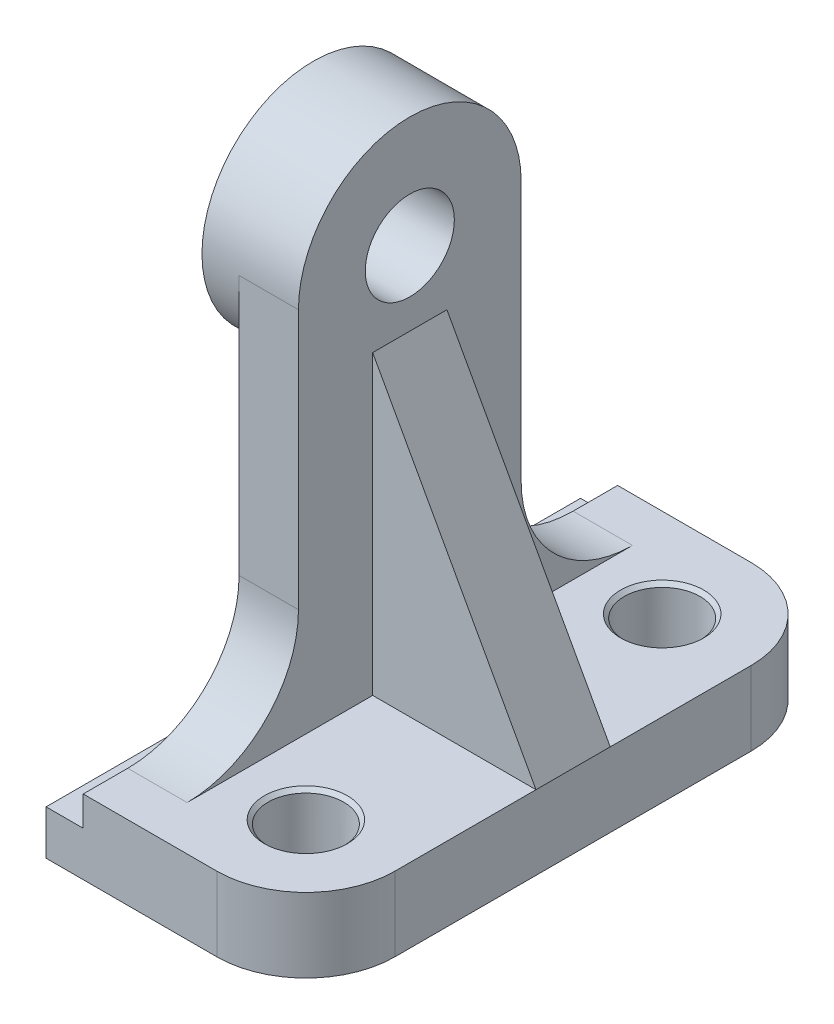
ISO-10303-21;
HEADER;
FILE_DESCRIPTION(('STEP AP214'),'2;1');
FILE_NAME('part.step','',(''),(''),'','','');
FILE_SCHEMA(('AUTOMOTIVE_DESIGN { 1 0 10303 214 1 1 1 1 }'));
ENDSEC;
DATA;
#1=APPLICATION_CONTEXT('core data for automotive mechanical design processes');
#2=APPLICATION_PROTOCOL_DEFINITION('international standard','automotive_design',2000,#1);
#3=PRODUCT_CONTEXT('',#1,'mechanical');
#4=PRODUCT('Part','Part','',(#3));
#5=PRODUCT_RELATED_PRODUCT_CATEGORY('part','',(#4));
#6=PRODUCT_DEFINITION_FORMATION('','',#4);
#7=PRODUCT_DEFINITION_CONTEXT('part definition',#1,'design');
#8=PRODUCT_DEFINITION('design','',#6,#7);
#9=PRODUCT_DEFINITION_SHAPE('','',#8);
#10=(LENGTH_UNIT() NAMED_UNIT(*) SI_UNIT(.MILLI.,.METRE.));
#11=(NAMED_UNIT(*) PLANE_ANGLE_UNIT() SI_UNIT($,.RADIAN.));
#12=(NAMED_UNIT(*) SI_UNIT($,.STERADIAN.) SOLID_ANGLE_UNIT());
#13=UNCERTAINTY_MEASURE_WITH_UNIT(LENGTH_MEASURE(1.E-05),#10,'distance_accuracy_value','');
#14=(GEOMETRIC_REPRESENTATION_CONTEXT(3) GLOBAL_UNCERTAINTY_ASSIGNED_CONTEXT((#13)) GLOBAL_UNIT_ASSIGNED_CONTEXT((#10,
#11,#12)) REPRESENTATION_CONTEXT('',''));
#15=CARTESIAN_POINT('',(0.,0.,0.));
#16=DIRECTION('',(0.,0.,1.));
#17=DIRECTION('',(1.,0.,0.));
#18=AXIS2_PLACEMENT_3D('',#15,#16,#17);
#19=CARTESIAN_POINT('',(-8.,0.,36.));
#20=DIRECTION('',(1.,0.,0.));
#21=DIRECTION('',(0.,0.,-1.));
#22=AXIS2_PLACEMENT_3D('',#19,#20,#21);
#23=PLANE('',#22);
#24=CARTESIAN_POINT('',(-8.,50.,0.));
#25=DIRECTION('',(-1.,0.,0.));
#26=DIRECTION('',(0.,0.,1.));
#27=AXIS2_PLACEMENT_3D('',#24,#25,#26);
#28=CIRCLE('',#27,15.);
#29=CARTESIAN_POINT('',(-8.,50.,-15.));
#30=VERTEX_POINT('',#29);
#31=CARTESIAN_POINT('',(-8.,50.,15.));
#32=VERTEX_POINT('',#31);
#33=EDGE_CURVE('E169',#30,#32,#28,.T.);
#34=ORIENTED_EDGE('',*,*,#33,.F.);
#35=DIRECTION('',(0.,1.,0.));
#36=VECTOR('',#35,1.);
#37=CARTESIAN_POINT('',(-8.,50.,-15.));
#38=LINE('',#37,#36);
#39=CARTESIAN_POINT('',(-8.,15.,-15.));
#40=VERTEX_POINT('',#39);
#41=EDGE_CURVE('E172',#40,#30,#38,.T.);
#42=ORIENTED_EDGE('',*,*,#41,.F.);
#43=CARTESIAN_POINT('',(-8.,15.,-30.));
#44=DIRECTION('',(-1.,0.,0.));
#45=DIRECTION('',(0.,0.,-1.));
#46=AXIS2_PLACEMENT_3D('',#43,#44,#45);
#47=CIRCLE('',#46,15.);
#48=CARTESIAN_POINT('',(-8.,0.,-30.));
#49=VERTEX_POINT('',#48);
#50=EDGE_CURVE('E198',#49,#40,#47,.T.);
#51=ORIENTED_EDGE('',*,*,#50,.F.);
#52=DIRECTION('',(0.,0.,-1.));
#53=VECTOR('',#52,1.);
#54=CARTESIAN_POINT('',(-8.,0.,36.));
#55=LINE('',#54,#53);
#56=CARTESIAN_POINT('',(-8.,0.,-36.));
#57=VERTEX_POINT('',#56);
#58=EDGE_CURVE('E290',#49,#57,#55,.T.);
#59=ORIENTED_EDGE('',*,*,#58,.T.);
#60=DIRECTION('',(0.,-1.,0.));
#61=VECTOR('',#60,1.);
#62=CARTESIAN_POINT('',(-8.,0.,-36.));
#63=LINE('',#62,#61);
#64=CARTESIAN_POINT('',(-8.,-4.,-36.));
#65=VERTEX_POINT('',#64);
#66=EDGE_CURVE('E264',#57,#65,#63,.T.);
#67=ORIENTED_EDGE('',*,*,#66,.T.);
#68=DIRECTION('',(0.,0.,-1.));
#69=VECTOR('',#68,1.);
#70=CARTESIAN_POINT('',(-8.,-4.,36.));
#71=LINE('',#70,#69);
#72=CARTESIAN_POINT('',(-8.,-4.,36.));
#73=VERTEX_POINT('',#72);
#74=EDGE_CURVE('E286',#73,#65,#71,.T.);
#75=ORIENTED_EDGE('',*,*,#74,.F.);
#76=DIRECTION('',(0.,-1.,0.));
#77=VECTOR('',#76,1.);
#78=CARTESIAN_POINT('',(-8.,0.,36.));
#79=LINE('',#78,#77);
#80=CARTESIAN_POINT('',(-8.,0.,36.));
#81=VERTEX_POINT('',#80);
#82=EDGE_CURVE('E247',#81,#73,#79,.T.);
#83=ORIENTED_EDGE('',*,*,#82,.F.);
#84=CARTESIAN_POINT('',(-8.,0.,30.));
#85=VERTEX_POINT('',#84);
#86=EDGE_CURVE('E291',#81,#85,#55,.T.);
#87=ORIENTED_EDGE('',*,*,#86,.T.);
#88=CARTESIAN_POINT('',(-8.,15.,30.));
#89=DIRECTION('',(-1.,0.,0.));
#90=DIRECTION('',(0.,0.,-1.));
#91=AXIS2_PLACEMENT_3D('',#88,#89,#90);
#92=CIRCLE('',#91,15.);
#93=CARTESIAN_POINT('',(-8.,15.,15.));
#94=VERTEX_POINT('',#93);
#95=EDGE_CURVE('E204',#94,#85,#92,.T.);
#96=ORIENTED_EDGE('',*,*,#95,.F.);
#97=DIRECTION('',(0.,-1.,0.));
#98=VECTOR('',#97,1.);
#99=CARTESIAN_POINT('',(-8.,50.,15.));
#100=LINE('',#99,#98);
#101=EDGE_CURVE('E176',#32,#94,#100,.T.);
#102=ORIENTED_EDGE('',*,*,#101,.F.);
#103=EDGE_LOOP('',(#34,#42,#51,#59,#67,#75,#83,#87,#96,#102));
#104=FACE_BOUND('',#103,.T.);
#105=ADVANCED_FACE('F47',(#104),#23,.F.);
#106=CARTESIAN_POINT('',(22.,0.,36.));
#107=DIRECTION('',(0.,-1.,0.));
#108=DIRECTION('',(1.,0.,0.));
#109=AXIS2_PLACEMENT_3D('',#106,#107,#108);
#110=PLANE('',#109);
#111=CARTESIAN_POINT('',(9.99999999999999,0.,-24.));
#112=DIRECTION('',(0.,-1.,0.));
#113=DIRECTION('',(1.,0.,0.));
#114=AXIS2_PLACEMENT_3D('',#111,#112,#113);
#115=CIRCLE('',#114,5.60000000000001);
#116=CARTESIAN_POINT('',(15.6,0.,-24.));
#117=VERTEX_POINT('',#116);
#118=EDGE_CURVE('E11',#117,#117,#115,.T.);
#119=ORIENTED_EDGE('',*,*,#118,.T.);
#120=EDGE_LOOP('',(#119));
#121=FACE_BOUND('',#120,.T.);
#122=DIRECTION('',(0.,0.,-1.));
#123=VECTOR('',#122,1.);
#124=CARTESIAN_POINT('',(22.,0.,36.));
#125=LINE('',#124,#123);
#126=CARTESIAN_POINT('',(22.,0.,-5.));
#127=VERTEX_POINT('',#126);
#128=CARTESIAN_POINT('',(22.,0.,-24.));
#129=VERTEX_POINT('',#128);
#130=EDGE_CURVE('E295',#127,#129,#125,.T.);
#131=ORIENTED_EDGE('',*,*,#130,.T.);
#132=CARTESIAN_POINT('',(10.,0.,-24.));
#133=DIRECTION('',(0.,-1.,0.));
#134=DIRECTION('',(1.,0.,0.));
#135=AXIS2_PLACEMENT_3D('',#132,#133,#134);
#136=CIRCLE('',#135,12.);
#137=CARTESIAN_POINT('',(10.,0.,-36.));
#138=VERTEX_POINT('',#137);
#139=EDGE_CURVE('E64',#129,#138,#136,.F.);
#140=ORIENTED_EDGE('',*,*,#139,.T.);
#141=DIRECTION('',(-1.,0.,0.));
#142=VECTOR('',#141,1.);
#143=CARTESIAN_POINT('',(22.,0.,-36.));
#144=LINE('',#143,#142);
#145=EDGE_CURVE('E233',#138,#57,#144,.T.);
#146=ORIENTED_EDGE('',*,*,#145,.T.);
#147=ORIENTED_EDGE('',*,*,#58,.F.);
#148=DIRECTION('',(1.,0.,0.));
#149=VECTOR('',#148,1.);
#150=CARTESIAN_POINT('',(-8.,0.,-30.));
#151=LINE('',#150,#149);
#152=CARTESIAN_POINT('',(0.,0.,-30.));
#153=VERTEX_POINT('',#152);
#154=EDGE_CURVE('E238',#49,#153,#151,.T.);
#155=ORIENTED_EDGE('',*,*,#154,.T.);
#156=DIRECTION('',(0.,0.,-1.));
#157=VECTOR('',#156,1.);
#158=CARTESIAN_POINT('',(0.,0.,30.));
#159=LINE('',#158,#157);
#160=CARTESIAN_POINT('',(0.,0.,-5.));
#161=VERTEX_POINT('',#160);
#162=EDGE_CURVE('E212',#161,#153,#159,.T.);
#163=ORIENTED_EDGE('',*,*,#162,.F.);
#164=DIRECTION('',(1.,0.,0.));
#165=VECTOR('',#164,1.);
#166=CARTESIAN_POINT('',(0.,0.,-5.));
#167=LINE('',#166,#165);
#168=EDGE_CURVE('E305',#161,#127,#167,.T.);
#169=ORIENTED_EDGE('',*,*,#168,.T.);
#170=EDGE_LOOP('',(#131,#140,#146,#147,#155,#163,#169));
#171=FACE_BOUND('',#170,.T.);
#172=ADVANCED_FACE('F375',(#121,#171),#110,.F.);
#173=CARTESIAN_POINT('',(0.,40.,5.));
#174=DIRECTION('',(-0.876215908676647,-0.481918749772156,0.));
#175=DIRECTION('',(0.481918749772156,-0.876215908676647,0.));
#176=AXIS2_PLACEMENT_3D('',#173,#174,#175);
#177=PLANE('',#176);
#178=DIRECTION('',(-0.481918749772156,0.876215908676647,0.));
#179=VECTOR('',#178,1.);
#180=CARTESIAN_POINT('',(0.,40.,-5.));
#181=LINE('',#180,#179);
#182=CARTESIAN_POINT('',(0.,40.,-5.));
#183=VERTEX_POINT('',#182);
#184=EDGE_CURVE('E299',#127,#183,#181,.T.);
#185=ORIENTED_EDGE('',*,*,#184,.T.);
#186=DIRECTION('',(0.,0.,-1.));
#187=VECTOR('',#186,1.);
#188=CARTESIAN_POINT('',(0.,40.,5.));
#189=LINE('',#188,#187);
#190=CARTESIAN_POINT('',(0.,40.,5.));
#191=VERTEX_POINT('',#190);
#192=EDGE_CURVE('E325',#191,#183,#189,.T.);
#193=ORIENTED_EDGE('',*,*,#192,.F.);
#194=DIRECTION('',(-0.481918749772156,0.876215908676647,0.));
#195=VECTOR('',#194,1.);
#196=CARTESIAN_POINT('',(0.,40.,5.));
#197=LINE('',#196,#195);
#198=CARTESIAN_POINT('',(22.,0.,5.));
#199=VERTEX_POINT('',#198);
#200=EDGE_CURVE('E300',#199,#191,#197,.T.);
#201=ORIENTED_EDGE('',*,*,#200,.F.);
#202=DIRECTION('',(0.,0.,-1.));
#203=VECTOR('',#202,1.);
#204=CARTESIAN_POINT('',(22.,0.,5.));
#205=LINE('',#204,#203);
#206=EDGE_CURVE('E313',#199,#127,#205,.T.);
#207=ORIENTED_EDGE('',*,*,#206,.T.);
#208=EDGE_LOOP('',(#185,#193,#201,#207));
#209=FACE_BOUND('',#208,.T.);
#210=ADVANCED_FACE('F382',(#209),#177,.F.);
#211=CARTESIAN_POINT('',(0.,0.,5.));
#212=DIRECTION('',(0.,0.,1.));
#213=DIRECTION('',(1.,0.,0.));
#214=AXIS2_PLACEMENT_3D('',#211,#212,#213);
#215=PLANE('',#214);
#216=ORIENTED_EDGE('',*,*,#200,.T.);
#217=DIRECTION('',(0.,-1.,0.));
#218=VECTOR('',#217,1.);
#219=CARTESIAN_POINT('',(0.,0.,5.));
#220=LINE('',#219,#218);
#221=CARTESIAN_POINT('',(0.,0.,5.));
#222=VERTEX_POINT('',#221);
#223=EDGE_CURVE('E304',#191,#222,#220,.T.);
#224=ORIENTED_EDGE('',*,*,#223,.T.);
#225=DIRECTION('',(1.,0.,0.));
#226=VECTOR('',#225,1.);
#227=CARTESIAN_POINT('',(0.,0.,5.));
#228=LINE('',#227,#226);
#229=EDGE_CURVE('E309',#222,#199,#228,.T.);
#230=ORIENTED_EDGE('',*,*,#229,.T.);
#231=EDGE_LOOP('',(#216,#224,#230));
#232=FACE_BOUND('',#231,.T.);
#233=ADVANCED_FACE('F397',(#232),#215,.T.);
#234=CARTESIAN_POINT('',(0.,0.,-5.));
#235=DIRECTION('',(0.,0.,1.));
#236=DIRECTION('',(1.,0.,0.));
#237=AXIS2_PLACEMENT_3D('',#234,#235,#236);
#238=PLANE('',#237);
#239=ORIENTED_EDGE('',*,*,#184,.F.);
#240=ORIENTED_EDGE('',*,*,#168,.F.);
#241=DIRECTION('',(0.,-1.,0.));
#242=VECTOR('',#241,1.);
#243=CARTESIAN_POINT('',(0.,0.,-5.));
#244=LINE('',#243,#242);
#245=EDGE_CURVE('E317',#183,#161,#244,.T.);
#246=ORIENTED_EDGE('',*,*,#245,.F.);
#247=EDGE_LOOP('',(#239,#240,#246));
#248=FACE_BOUND('',#247,.T.);
#249=ADVANCED_FACE('F392',(#248),#238,.F.);
#250=CARTESIAN_POINT('',(9.99999999999999,0.,24.));
#251=DIRECTION('',(0.,-1.,0.));
#252=DIRECTION('',(1.,0.,0.));
#253=AXIS2_PLACEMENT_3D('',#250,#251,#252);
#254=CIRCLE('',#253,5.59999999999999);
#255=CARTESIAN_POINT('',(15.6,0.,24.));
#256=VERTEX_POINT('',#255);
#257=EDGE_CURVE('E356',#256,#256,#254,.T.);
#258=ORIENTED_EDGE('',*,*,#257,.T.);
#259=EDGE_LOOP('',(#258));
#260=FACE_BOUND('',#259,.T.);
#261=DIRECTION('',(-1.,0.,0.));
#262=VECTOR('',#261,1.);
#263=CARTESIAN_POINT('',(22.,0.,36.));
#264=LINE('',#263,#262);
#265=CARTESIAN_POINT('',(10.,0.,36.));
#266=VERTEX_POINT('',#265);
#267=EDGE_CURVE('E244',#266,#81,#264,.T.);
#268=ORIENTED_EDGE('',*,*,#267,.F.);
#269=CARTESIAN_POINT('',(10.,0.,24.));
#270=DIRECTION('',(0.,-1.,0.));
#271=DIRECTION('',(1.,0.,0.));
#272=AXIS2_PLACEMENT_3D('',#269,#270,#271);
#273=CIRCLE('',#272,12.);
#274=CARTESIAN_POINT('',(22.,0.,24.));
#275=VERTEX_POINT('',#274);
#276=EDGE_CURVE('E332',#266,#275,#273,.F.);
#277=ORIENTED_EDGE('',*,*,#276,.T.);
#278=EDGE_CURVE('E296',#275,#199,#125,.T.);
#279=ORIENTED_EDGE('',*,*,#278,.T.);
#280=ORIENTED_EDGE('',*,*,#229,.F.);
#281=CARTESIAN_POINT('',(0.,0.,30.));
#282=VERTEX_POINT('',#281);
#283=EDGE_CURVE('E214',#282,#222,#159,.T.);
#284=ORIENTED_EDGE('',*,*,#283,.F.);
#285=DIRECTION('',(1.,0.,0.));
#286=VECTOR('',#285,1.);
#287=CARTESIAN_POINT('',(-8.,0.,30.));
#288=LINE('',#287,#286);
#289=EDGE_CURVE('E202',#85,#282,#288,.T.);
#290=ORIENTED_EDGE('',*,*,#289,.F.);
#291=ORIENTED_EDGE('',*,*,#86,.F.);
#292=EDGE_LOOP('',(#268,#277,#279,#280,#284,#290,#291));
#293=FACE_BOUND('',#292,.T.);
#294=ADVANCED_FACE('F385',(#260,#293),#110,.F.);
#295=CARTESIAN_POINT('',(22.,0.,36.));
#296=DIRECTION('',(-1.,0.,0.));
#297=DIRECTION('',(0.,0.,1.));
#298=AXIS2_PLACEMENT_3D('',#295,#296,#297);
#299=PLANE('',#298);
#300=ORIENTED_EDGE('',*,*,#278,.F.);
#301=DIRECTION('',(0.,1.,0.));
#302=VECTOR('',#301,1.);
#303=CARTESIAN_POINT('',(22.,0.,24.));
#304=LINE('',#303,#302);
#305=CARTESIAN_POINT('',(22.,-10.,24.));
#306=VERTEX_POINT('',#305);
#307=EDGE_CURVE('E339',#275,#306,#304,.F.);
#308=ORIENTED_EDGE('',*,*,#307,.T.);
#309=DIRECTION('',(0.,0.,-1.));
#310=VECTOR('',#309,1.);
#311=CARTESIAN_POINT('',(22.,-10.,36.));
#312=LINE('',#311,#310);
#313=CARTESIAN_POINT('',(22.,-10.,-24.));
#314=VERTEX_POINT('',#313);
#315=EDGE_CURVE('E261',#306,#314,#312,.T.);
#316=ORIENTED_EDGE('',*,*,#315,.T.);
#317=DIRECTION('',(0.,1.,0.));
#318=VECTOR('',#317,1.);
#319=CARTESIAN_POINT('',(22.,0.,-24.));
#320=LINE('',#319,#318);
#321=EDGE_CURVE('E335',#314,#129,#320,.T.);
#322=ORIENTED_EDGE('',*,*,#321,.T.);
#323=ORIENTED_EDGE('',*,*,#130,.F.);
#324=ORIENTED_EDGE('',*,*,#206,.F.);
#325=EDGE_LOOP('',(#300,#308,#316,#322,#323,#324));
#326=FACE_BOUND('',#325,.T.);
#327=ADVANCED_FACE('F391',(#326),#299,.F.);
#328=CARTESIAN_POINT('',(-8.,-4.,36.));
#329=DIRECTION('',(0.,-1.,0.));
#330=DIRECTION('',(1.,0.,0.));
#331=AXIS2_PLACEMENT_3D('',#328,#329,#330);
#332=PLANE('',#331);
#333=DIRECTION('',(-1.,0.,0.));
#334=VECTOR('',#333,1.);
#335=CARTESIAN_POINT('',(-8.,-4.,-36.));
#336=LINE('',#335,#334);
#337=CARTESIAN_POINT('',(-13.,-4.,-36.));
#338=VERTEX_POINT('',#337);
#339=EDGE_CURVE('E267',#65,#338,#336,.T.);
#340=ORIENTED_EDGE('',*,*,#339,.T.);
#341=DIRECTION('',(0.,0.,-1.));
#342=VECTOR('',#341,1.);
#343=CARTESIAN_POINT('',(-13.,-4.,36.));
#344=LINE('',#343,#342);
#345=CARTESIAN_POINT('',(-13.,-4.,36.));
#346=VERTEX_POINT('',#345);
#347=EDGE_CURVE('E282',#346,#338,#344,.T.);
#348=ORIENTED_EDGE('',*,*,#347,.F.);
#349=DIRECTION('',(-1.,0.,0.));
#350=VECTOR('',#349,1.);
#351=CARTESIAN_POINT('',(-8.,-4.,36.));
#352=LINE('',#351,#350);
#353=EDGE_CURVE('E251',#73,#346,#352,.T.);
#354=ORIENTED_EDGE('',*,*,#353,.F.);
#355=ORIENTED_EDGE('',*,*,#74,.T.);
#356=EDGE_LOOP('',(#340,#348,#354,#355));
#357=FACE_BOUND('',#356,.T.);
#358=ADVANCED_FACE('F387',(#357),#332,.F.);
#359=CARTESIAN_POINT('',(-13.,-10.,36.));
#360=DIRECTION('',(1.,0.,0.));
#361=DIRECTION('',(0.,0.,-1.));
#362=AXIS2_PLACEMENT_3D('',#359,#360,#361);
#363=PLANE('',#362);
#364=DIRECTION('',(0.,-1.,0.));
#365=VECTOR('',#364,1.);
#366=CARTESIAN_POINT('',(-13.,-10.,-36.));
#367=LINE('',#366,#365);
#368=CARTESIAN_POINT('',(-13.,-10.,-36.));
#369=VERTEX_POINT('',#368);
#370=EDGE_CURVE('E270',#338,#369,#367,.T.);
#371=ORIENTED_EDGE('',*,*,#370,.T.);
#372=DIRECTION('',(0.,0.,-1.));
#373=VECTOR('',#372,1.);
#374=CARTESIAN_POINT('',(-13.,-10.,36.));
#375=LINE('',#374,#373);
#376=CARTESIAN_POINT('',(-13.,-10.,36.));
#377=VERTEX_POINT('',#376);
#378=EDGE_CURVE('E278',#377,#369,#375,.T.);
#379=ORIENTED_EDGE('',*,*,#378,.F.);
#380=DIRECTION('',(0.,-1.,0.));
#381=VECTOR('',#380,1.);
#382=CARTESIAN_POINT('',(-13.,-10.,36.));
#383=LINE('',#382,#381);
#384=EDGE_CURVE('E254',#346,#377,#383,.T.);
#385=ORIENTED_EDGE('',*,*,#384,.F.);
#386=ORIENTED_EDGE('',*,*,#347,.T.);
#387=EDGE_LOOP('',(#371,#379,#385,#386));
#388=FACE_BOUND('',#387,.T.);
#389=ADVANCED_FACE('F447',(#388),#363,.F.);
#390=CARTESIAN_POINT('',(22.,-10.,36.));
#391=DIRECTION('',(0.,1.,0.));
#392=DIRECTION('',(0.,0.,1.));
#393=AXIS2_PLACEMENT_3D('',#390,#391,#392);
#394=PLANE('',#393);
#395=CARTESIAN_POINT('',(9.99999999999999,-10.,-24.));
#396=DIRECTION('',(0.,1.,0.));
#397=DIRECTION('',(-1.,0.,0.));
#398=AXIS2_PLACEMENT_3D('',#395,#396,#397);
#399=CIRCLE('',#398,5.1);
#400=CARTESIAN_POINT('',(4.89999999999999,-10.,-24.));
#401=VERTEX_POINT('',#400);
#402=EDGE_CURVE('E479',#401,#401,#399,.T.);
#403=ORIENTED_EDGE('',*,*,#402,.T.);
#404=EDGE_LOOP('',(#403));
#405=FACE_BOUND('',#404,.T.);
#406=CARTESIAN_POINT('',(10.,-10.,24.));
#407=DIRECTION('',(0.,1.,0.));
#408=DIRECTION('',(-1.,0.,0.));
#409=AXIS2_PLACEMENT_3D('',#406,#407,#408);
#410=CIRCLE('',#409,5.1);
#411=CARTESIAN_POINT('',(4.9,-10.,24.));
#412=VERTEX_POINT('',#411);
#413=EDGE_CURVE('E483',#412,#412,#410,.T.);
#414=ORIENTED_EDGE('',*,*,#413,.T.);
#415=EDGE_LOOP('',(#414));
#416=FACE_BOUND('',#415,.T.);
#417=ORIENTED_EDGE('',*,*,#315,.F.);
#418=CARTESIAN_POINT('',(10.,-10.,24.));
#419=DIRECTION('',(0.,1.,0.));
#420=DIRECTION('',(0.,0.,1.));
#421=AXIS2_PLACEMENT_3D('',#418,#419,#420);
#422=CIRCLE('',#421,12.);
#423=CARTESIAN_POINT('',(10.,-10.,36.));
#424=VERTEX_POINT('',#423);
#425=EDGE_CURVE('E345',#306,#424,#422,.F.);
#426=ORIENTED_EDGE('',*,*,#425,.T.);
#427=DIRECTION('',(1.,0.,0.));
#428=VECTOR('',#427,1.);
#429=CARTESIAN_POINT('',(22.,-10.,36.));
#430=LINE('',#429,#428);
#431=EDGE_CURVE('E257',#377,#424,#430,.T.);
#432=ORIENTED_EDGE('',*,*,#431,.F.);
#433=ORIENTED_EDGE('',*,*,#378,.T.);
#434=DIRECTION('',(1.,0.,0.));
#435=VECTOR('',#434,1.);
#436=CARTESIAN_POINT('',(22.,-10.,-36.));
#437=LINE('',#436,#435);
#438=CARTESIAN_POINT('',(10.,-10.,-36.));
#439=VERTEX_POINT('',#438);
#440=EDGE_CURVE('E248',#369,#439,#437,.T.);
#441=ORIENTED_EDGE('',*,*,#440,.T.);
#442=CARTESIAN_POINT('',(10.,-10.,-24.));
#443=DIRECTION('',(0.,1.,0.));
#444=DIRECTION('',(0.,0.,1.));
#445=AXIS2_PLACEMENT_3D('',#442,#443,#444);
#446=CIRCLE('',#445,12.);
#447=EDGE_CURVE('E342',#439,#314,#446,.F.);
#448=ORIENTED_EDGE('',*,*,#447,.T.);
#449=EDGE_LOOP('',(#417,#426,#432,#433,#441,#448));
#450=FACE_BOUND('',#449,.T.);
#451=ADVANCED_FACE('F431',(#405,#416,#450),#394,.F.);
#452=CARTESIAN_POINT('',(0.,0.,36.));
#453=DIRECTION('',(0.,0.,-1.));
#454=DIRECTION('',(-1.,0.,0.));
#455=AXIS2_PLACEMENT_3D('',#452,#453,#454);
#456=PLANE('',#455);
#457=ORIENTED_EDGE('',*,*,#431,.T.);
#458=DIRECTION('',(0.,1.,0.));
#459=VECTOR('',#458,1.);
#460=CARTESIAN_POINT('',(10.,0.,36.));
#461=LINE('',#460,#459);
#462=EDGE_CURVE('E328',#424,#266,#461,.T.);
#463=ORIENTED_EDGE('',*,*,#462,.T.);
#464=ORIENTED_EDGE('',*,*,#267,.T.);
#465=ORIENTED_EDGE('',*,*,#82,.T.);
#466=ORIENTED_EDGE('',*,*,#353,.T.);
#467=ORIENTED_EDGE('',*,*,#384,.T.);
#468=EDGE_LOOP('',(#457,#463,#464,#465,#466,#467));
#469=FACE_BOUND('',#468,.T.);
#470=ADVANCED_FACE('F440',(#469),#456,.F.);
#471=CARTESIAN_POINT('',(0.,0.,-36.));
#472=DIRECTION('',(0.,0.,-1.));
#473=DIRECTION('',(-1.,0.,0.));
#474=AXIS2_PLACEMENT_3D('',#471,#472,#473);
#475=PLANE('',#474);
#476=ORIENTED_EDGE('',*,*,#145,.F.);
#477=DIRECTION('',(0.,1.,0.));
#478=VECTOR('',#477,1.);
#479=CARTESIAN_POINT('',(10.,-10.,-36.));
#480=LINE('',#479,#478);
#481=EDGE_CURVE('E71',#138,#439,#480,.F.);
#482=ORIENTED_EDGE('',*,*,#481,.T.);
#483=ORIENTED_EDGE('',*,*,#440,.F.);
#484=ORIENTED_EDGE('',*,*,#370,.F.);
#485=ORIENTED_EDGE('',*,*,#339,.F.);
#486=ORIENTED_EDGE('',*,*,#66,.F.);
#487=EDGE_LOOP('',(#476,#482,#483,#484,#485,#486));
#488=FACE_BOUND('',#487,.T.);
#489=ADVANCED_FACE('F449',(#488),#475,.T.);
#490=CARTESIAN_POINT('',(-8.,15.,30.));
#491=DIRECTION('',(1.,0.,0.));
#492=DIRECTION('',(0.,0.,-1.));
#493=AXIS2_PLACEMENT_3D('',#490,#491,#492);
#494=CYLINDRICAL_SURFACE('',#493,15.);
#495=CARTESIAN_POINT('',(0.,15.,30.));
#496=DIRECTION('',(-1.,0.,0.));
#497=DIRECTION('',(0.,0.,-1.));
#498=AXIS2_PLACEMENT_3D('',#495,#496,#497);
#499=CIRCLE('',#498,15.);
#500=CARTESIAN_POINT('',(0.,15.,15.));
#501=VERTEX_POINT('',#500);
#502=EDGE_CURVE('E208',#501,#282,#499,.T.);
#503=ORIENTED_EDGE('',*,*,#502,.F.);
#504=DIRECTION('',(1.,0.,0.));
#505=VECTOR('',#504,1.);
#506=CARTESIAN_POINT('',(-8.,15.,15.));
#507=LINE('',#506,#505);
#508=EDGE_CURVE('E230',#94,#501,#507,.T.);
#509=ORIENTED_EDGE('',*,*,#508,.F.);
#510=ORIENTED_EDGE('',*,*,#95,.T.);
#511=ORIENTED_EDGE('',*,*,#289,.T.);
#512=EDGE_LOOP('',(#503,#509,#510,#511));
#513=FACE_BOUND('',#512,.T.);
#514=ADVANCED_FACE('F493',(#513),#494,.F.);
#515=CARTESIAN_POINT('',(-8.,50.,15.));
#516=DIRECTION('',(0.,0.,1.));
#517=DIRECTION('',(0.,-1.,0.));
#518=AXIS2_PLACEMENT_3D('',#515,#516,#517);
#519=PLANE('',#518);
#520=DIRECTION('',(0.,-1.,0.));
#521=VECTOR('',#520,1.);
#522=CARTESIAN_POINT('',(0.,50.,15.));
#523=LINE('',#522,#521);
#524=CARTESIAN_POINT('',(0.,50.,15.));
#525=VERTEX_POINT('',#524);
#526=EDGE_CURVE('E226',#525,#501,#523,.T.);
#527=ORIENTED_EDGE('',*,*,#526,.F.);
#528=DIRECTION('',(1.,0.,0.));
#529=VECTOR('',#528,1.);
#530=CARTESIAN_POINT('',(-8.,50.,15.));
#531=LINE('',#530,#529);
#532=EDGE_CURVE('E193',#32,#525,#531,.T.);
#533=ORIENTED_EDGE('',*,*,#532,.F.);
#534=ORIENTED_EDGE('',*,*,#101,.T.);
#535=ORIENTED_EDGE('',*,*,#508,.T.);
#536=EDGE_LOOP('',(#527,#533,#534,#535));
#537=FACE_BOUND('',#536,.T.);
#538=ADVANCED_FACE('F500',(#537),#519,.T.);
#539=CARTESIAN_POINT('',(-8.,50.,0.));
#540=DIRECTION('',(1.,0.,0.));
#541=DIRECTION('',(0.,0.,-1.));
#542=AXIS2_PLACEMENT_3D('',#539,#540,#541);
#543=CYLINDRICAL_SURFACE('',#542,15.);
#544=CARTESIAN_POINT('',(0.,50.,0.));
#545=DIRECTION('',(1.,0.,0.));
#546=DIRECTION('',(0.,0.,-1.));
#547=AXIS2_PLACEMENT_3D('',#544,#545,#546);
#548=CIRCLE('',#547,15.);
#549=CARTESIAN_POINT('',(0.,50.,-15.));
#550=VERTEX_POINT('',#549);
#551=EDGE_CURVE('E188',#550,#525,#548,.T.);
#552=ORIENTED_EDGE('',*,*,#551,.F.);
#553=DIRECTION('',(1.,0.,0.));
#554=VECTOR('',#553,1.);
#555=CARTESIAN_POINT('',(-8.,50.,-15.));
#556=LINE('',#555,#554);
#557=EDGE_CURVE('E184',#30,#550,#556,.T.);
#558=ORIENTED_EDGE('',*,*,#557,.F.);
#559=ORIENTED_EDGE('',*,*,#33,.T.);
#560=ORIENTED_EDGE('',*,*,#532,.T.);
#561=EDGE_LOOP('',(#552,#558,#559,#560));
#562=FACE_BOUND('',#561,.T.);
#563=CARTESIAN_POINT('',(-13.,50.,0.));
#564=DIRECTION('',(-1.,0.,0.));
#565=DIRECTION('',(0.,0.,1.));
#566=AXIS2_PLACEMENT_3D('',#563,#564,#565);
#567=CIRCLE('',#566,15.);
#568=CARTESIAN_POINT('',(-13.,50.,15.));
#569=VERTEX_POINT('',#568);
#570=EDGE_CURVE('E180',#569,#569,#567,.T.);
#571=ORIENTED_EDGE('',*,*,#570,.F.);
#572=EDGE_LOOP('',(#571));
#573=FACE_BOUND('',#572,.T.);
#574=ADVANCED_FACE('F185',(#562,#573),#543,.T.);
#575=CARTESIAN_POINT('',(-8.,50.,-15.));
#576=DIRECTION('',(0.,0.,-1.));
#577=DIRECTION('',(0.,1.,0.));
#578=AXIS2_PLACEMENT_3D('',#575,#576,#577);
#579=PLANE('',#578);
#580=DIRECTION('',(0.,1.,0.));
#581=VECTOR('',#580,1.);
#582=CARTESIAN_POINT('',(0.,50.,-15.));
#583=LINE('',#582,#581);
#584=CARTESIAN_POINT('',(0.,15.,-15.));
#585=VERTEX_POINT('',#584);
#586=EDGE_CURVE('E221',#585,#550,#583,.T.);
#587=ORIENTED_EDGE('',*,*,#586,.F.);
#588=DIRECTION('',(1.,0.,0.));
#589=VECTOR('',#588,1.);
#590=CARTESIAN_POINT('',(-8.,15.,-15.));
#591=LINE('',#590,#589);
#592=EDGE_CURVE('E194',#40,#585,#591,.T.);
#593=ORIENTED_EDGE('',*,*,#592,.F.);
#594=ORIENTED_EDGE('',*,*,#41,.T.);
#595=ORIENTED_EDGE('',*,*,#557,.T.);
#596=EDGE_LOOP('',(#587,#593,#594,#595));
#597=FACE_BOUND('',#596,.T.);
#598=ADVANCED_FACE('F196',(#597),#579,.T.);
#599=CARTESIAN_POINT('',(-8.,15.,-30.));
#600=DIRECTION('',(1.,0.,0.));
#601=DIRECTION('',(0.,0.,-1.));
#602=AXIS2_PLACEMENT_3D('',#599,#600,#601);
#603=CYLINDRICAL_SURFACE('',#602,15.);
#604=CARTESIAN_POINT('',(0.,15.,-30.));
#605=DIRECTION('',(-1.,0.,0.));
#606=DIRECTION('',(0.,0.,-1.));
#607=AXIS2_PLACEMENT_3D('',#604,#605,#606);
#608=CIRCLE('',#607,15.);
#609=EDGE_CURVE('E217',#153,#585,#608,.T.);
#610=ORIENTED_EDGE('',*,*,#609,.F.);
#611=ORIENTED_EDGE('',*,*,#154,.F.);
#612=ORIENTED_EDGE('',*,*,#50,.T.);
#613=ORIENTED_EDGE('',*,*,#592,.T.);
#614=EDGE_LOOP('',(#610,#611,#612,#613));
#615=FACE_BOUND('',#614,.T.);
#616=ADVANCED_FACE('F513',(#615),#603,.F.);
#617=CARTESIAN_POINT('',(0.,15.,30.));
#618=DIRECTION('',(1.,0.,0.));
#619=DIRECTION('',(0.,0.,-1.));
#620=AXIS2_PLACEMENT_3D('',#617,#618,#619);
#621=PLANE('',#620);
#622=CARTESIAN_POINT('',(0.,50.,0.));
#623=DIRECTION('',(1.,0.,0.));
#624=DIRECTION('',(0.,0.,-1.));
#625=AXIS2_PLACEMENT_3D('',#622,#623,#624);
#626=CIRCLE('',#625,6.);
#627=CARTESIAN_POINT('',(0.,50.,-6.));
#628=VERTEX_POINT('',#627);
#629=EDGE_CURVE('E213',#628,#628,#626,.T.);
#630=ORIENTED_EDGE('',*,*,#629,.F.);
#631=EDGE_LOOP('',(#630));
#632=FACE_BOUND('',#631,.T.);
#633=ORIENTED_EDGE('',*,*,#283,.T.);
#634=ORIENTED_EDGE('',*,*,#223,.F.);
#635=ORIENTED_EDGE('',*,*,#192,.T.);
#636=ORIENTED_EDGE('',*,*,#245,.T.);
#637=ORIENTED_EDGE('',*,*,#162,.T.);
#638=ORIENTED_EDGE('',*,*,#609,.T.);
#639=ORIENTED_EDGE('',*,*,#586,.T.);
#640=ORIENTED_EDGE('',*,*,#551,.T.);
#641=ORIENTED_EDGE('',*,*,#526,.T.);
#642=ORIENTED_EDGE('',*,*,#502,.T.);
#643=EDGE_LOOP('',(#633,#634,#635,#636,#637,#638,#639,#640,#641,#642));
#644=FACE_BOUND('',#643,.T.);
#645=ADVANCED_FACE('F467',(#632,#644),#621,.T.);
#646=CARTESIAN_POINT('',(-8.,50.,0.));
#647=DIRECTION('',(1.,0.,0.));
#648=DIRECTION('',(0.,0.,-1.));
#649=AXIS2_PLACEMENT_3D('',#646,#647,#648);
#650=CYLINDRICAL_SURFACE('',#649,6.);
#651=ORIENTED_EDGE('',*,*,#629,.T.);
#652=EDGE_LOOP('',(#651));
#653=FACE_BOUND('',#652,.T.);
#654=CARTESIAN_POINT('',(-13.,50.,0.));
#655=DIRECTION('',(-1.,0.,0.));
#656=DIRECTION('',(0.,0.,1.));
#657=AXIS2_PLACEMENT_3D('',#654,#655,#656);
#658=CIRCLE('',#657,6.);
#659=CARTESIAN_POINT('',(-13.,50.,6.));
#660=VERTEX_POINT('',#659);
#661=EDGE_CURVE('E181',#660,#660,#658,.T.);
#662=ORIENTED_EDGE('',*,*,#661,.T.);
#663=EDGE_LOOP('',(#662));
#664=FACE_BOUND('',#663,.T.);
#665=ADVANCED_FACE('F603',(#653,#664),#650,.F.);
#666=CARTESIAN_POINT('',(-13.,50.,0.));
#667=DIRECTION('',(-1.,0.,0.));
#668=DIRECTION('',(0.,0.,1.));
#669=AXIS2_PLACEMENT_3D('',#666,#667,#668);
#670=PLANE('',#669);
#671=ORIENTED_EDGE('',*,*,#570,.T.);
#672=EDGE_LOOP('',(#671));
#673=FACE_BOUND('',#672,.T.);
#674=ORIENTED_EDGE('',*,*,#661,.F.);
#675=EDGE_LOOP('',(#674));
#676=FACE_BOUND('',#675,.T.);
#677=ADVANCED_FACE('F411',(#673,#676),#670,.T.);
#678=CARTESIAN_POINT('',(10.,0.,24.));
#679=DIRECTION('',(0.,1.,0.));
#680=DIRECTION('',(0.,0.,1.));
#681=AXIS2_PLACEMENT_3D('',#678,#679,#680);
#682=CYLINDRICAL_SURFACE('',#681,12.);
#683=ORIENTED_EDGE('',*,*,#425,.F.);
#684=ORIENTED_EDGE('',*,*,#307,.F.);
#685=ORIENTED_EDGE('',*,*,#276,.F.);
#686=ORIENTED_EDGE('',*,*,#462,.F.);
#687=EDGE_LOOP('',(#683,#684,#685,#686));
#688=FACE_BOUND('',#687,.T.);
#689=ADVANCED_FACE('F407',(#688),#682,.T.);
#690=CARTESIAN_POINT('',(10.,0.,-24.));
#691=DIRECTION('',(0.,-1.,0.));
#692=DIRECTION('',(0.,0.,-1.));
#693=AXIS2_PLACEMENT_3D('',#690,#691,#692);
#694=CYLINDRICAL_SURFACE('',#693,12.);
#695=ORIENTED_EDGE('',*,*,#447,.F.);
#696=ORIENTED_EDGE('',*,*,#481,.F.);
#697=ORIENTED_EDGE('',*,*,#139,.F.);
#698=ORIENTED_EDGE('',*,*,#321,.F.);
#699=EDGE_LOOP('',(#695,#696,#697,#698));
#700=FACE_BOUND('',#699,.T.);
#701=ADVANCED_FACE('F410',(#700),#694,.T.);
#702=CARTESIAN_POINT('',(10.,-10.,24.));
#703=DIRECTION('',(0.,1.,0.));
#704=DIRECTION('',(-1.,0.,0.));
#705=AXIS2_PLACEMENT_3D('',#702,#703,#704);
#706=CYLINDRICAL_SURFACE('',#705,5.1);
#707=CARTESIAN_POINT('',(9.99999999999999,-0.499999999999985,24.));
#708=DIRECTION('',(0.,-1.,0.));
#709=DIRECTION('',(0.,0.,-1.));
#710=AXIS2_PLACEMENT_3D('',#707,#708,#709);
#711=CIRCLE('',#710,5.1);
#712=CARTESIAN_POINT('',(9.99999999999999,-0.499999999999985,18.9));
#713=VERTEX_POINT('',#712);
#714=EDGE_CURVE('E352',#713,#713,#711,.F.);
#715=ORIENTED_EDGE('',*,*,#714,.T.);
#716=EDGE_LOOP('',(#715));
#717=FACE_BOUND('',#716,.T.);
#718=ORIENTED_EDGE('',*,*,#413,.F.);
#719=EDGE_LOOP('',(#718));
#720=FACE_BOUND('',#719,.T.);
#721=ADVANCED_FACE('F414',(#717,#720),#706,.F.);
#722=CARTESIAN_POINT('',(9.99999999999999,-10.,-24.));
#723=DIRECTION('',(0.,1.,0.));
#724=DIRECTION('',(-1.,0.,0.));
#725=AXIS2_PLACEMENT_3D('',#722,#723,#724);
#726=CYLINDRICAL_SURFACE('',#725,5.1);
#727=CARTESIAN_POINT('',(9.99999999999999,-0.500000000000013,-24.));
#728=DIRECTION('',(0.,-1.,0.));
#729=DIRECTION('',(0.,0.,-1.));
#730=AXIS2_PLACEMENT_3D('',#727,#728,#729);
#731=CIRCLE('',#730,5.1);
#732=CARTESIAN_POINT('',(9.99999999999999,-0.500000000000013,-29.1));
#733=VERTEX_POINT('',#732);
#734=EDGE_CURVE('E57',#733,#733,#731,.F.);
#735=ORIENTED_EDGE('',*,*,#734,.T.);
#736=EDGE_LOOP('',(#735));
#737=FACE_BOUND('',#736,.T.);
#738=ORIENTED_EDGE('',*,*,#402,.F.);
#739=EDGE_LOOP('',(#738));
#740=FACE_BOUND('',#739,.T.);
#741=ADVANCED_FACE('F363',(#737,#740),#726,.F.);
#742=CARTESIAN_POINT('',(9.99999999999999,-0.499999999999985,24.));
#743=DIRECTION('',(0.,1.,0.));
#744=DIRECTION('',(0.,0.,1.));
#745=AXIS2_PLACEMENT_3D('',#742,#743,#744);
#746=CONICAL_SURFACE('',#745,5.1,0.785398163397457);
#747=ORIENTED_EDGE('',*,*,#257,.F.);
#748=EDGE_LOOP('',(#747));
#749=FACE_BOUND('',#748,.T.);
#750=ORIENTED_EDGE('',*,*,#714,.F.);
#751=EDGE_LOOP('',(#750));
#752=FACE_BOUND('',#751,.T.);
#753=ADVANCED_FACE('F367',(#749,#752),#746,.F.);
#754=CARTESIAN_POINT('',(9.99999999999999,-0.500000000000013,-24.));
#755=DIRECTION('',(0.,1.,0.));
#756=DIRECTION('',(0.,0.,1.));
#757=AXIS2_PLACEMENT_3D('',#754,#755,#756);
#758=CONICAL_SURFACE('',#757,5.1,0.785398163397443);
#759=ORIENTED_EDGE('',*,*,#118,.F.);
#760=EDGE_LOOP('',(#759));
#761=FACE_BOUND('',#760,.T.);
#762=ORIENTED_EDGE('',*,*,#734,.F.);
#763=EDGE_LOOP('',(#762));
#764=FACE_BOUND('',#763,.T.);
#765=ADVANCED_FACE('F50',(#761,#764),#758,.F.);
#766=CLOSED_SHELL('',(#105,#172,#210,#233,#249,#294,#327,#358,#389,#451,#470,#489,#514,#538,
#574,#598,#616,#645,#665,#677,#689,#701,#721,#741,#753,#765));
#767=MANIFOLD_SOLID_BREP('B2',#766);
#768=ADVANCED_BREP_SHAPE_REPRESENTATION('',(#18,#767),#14);
#769=SHAPE_DEFINITION_REPRESENTATION(#9,#768);
ENDSEC;
END-ISO-10303-21;
